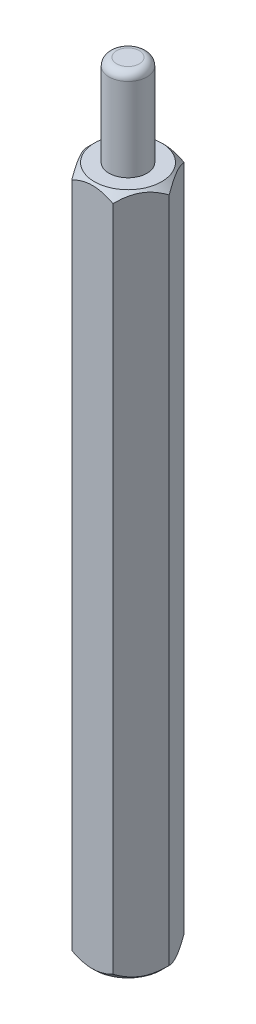
ISO-10303-21;
HEADER;
FILE_DESCRIPTION(('STEP AP214'),'2;1');
FILE_NAME('part.step','',(''),(''),'','','');
FILE_SCHEMA(('AUTOMOTIVE_DESIGN { 1 0 10303 214 1 1 1 1 }'));
ENDSEC;
DATA;
#1=APPLICATION_CONTEXT('core data for automotive mechanical design processes');
#2=APPLICATION_PROTOCOL_DEFINITION('international standard','automotive_design',2000,#1);
#3=PRODUCT_CONTEXT('',#1,'mechanical');
#4=PRODUCT('Part','Part','',(#3));
#5=PRODUCT_RELATED_PRODUCT_CATEGORY('part','',(#4));
#6=PRODUCT_DEFINITION_FORMATION('','',#4);
#7=PRODUCT_DEFINITION_CONTEXT('part definition',#1,'design');
#8=PRODUCT_DEFINITION('design','',#6,#7);
#9=PRODUCT_DEFINITION_SHAPE('','',#8);
#10=(LENGTH_UNIT() NAMED_UNIT(*) SI_UNIT(.MILLI.,.METRE.));
#11=(NAMED_UNIT(*) PLANE_ANGLE_UNIT() SI_UNIT($,.RADIAN.));
#12=(NAMED_UNIT(*) SI_UNIT($,.STERADIAN.) SOLID_ANGLE_UNIT());
#13=UNCERTAINTY_MEASURE_WITH_UNIT(LENGTH_MEASURE(1.E-05),#10,'distance_accuracy_value','');
#14=(GEOMETRIC_REPRESENTATION_CONTEXT(3) GLOBAL_UNCERTAINTY_ASSIGNED_CONTEXT((#13)) GLOBAL_UNIT_ASSIGNED_CONTEXT((#10,
#11,#12)) REPRESENTATION_CONTEXT('',''));
#15=CARTESIAN_POINT('',(0.,0.,0.));
#16=DIRECTION('',(0.,0.,1.));
#17=DIRECTION('',(1.,0.,0.));
#18=AXIS2_PLACEMENT_3D('',#15,#16,#17);
#19=CARTESIAN_POINT('',(0.,51.,0.));
#20=DIRECTION('',(0.,-1.,0.));
#21=DIRECTION('',(0.,0.,-1.));
#22=AXIS2_PLACEMENT_3D('',#19,#20,#21);
#23=CYLINDRICAL_SURFACE('',#22,1.25);
#24=CARTESIAN_POINT('',(0.,50.5,0.));
#25=DIRECTION('',(0.,1.,0.));
#26=DIRECTION('',(0.,0.,1.));
#27=AXIS2_PLACEMENT_3D('',#24,#25,#26);
#28=CIRCLE('',#27,1.25);
#29=CARTESIAN_POINT('',(0.,50.5,1.25));
#30=VERTEX_POINT('',#29);
#31=EDGE_CURVE('E11',#30,#30,#28,.F.);
#32=ORIENTED_EDGE('',*,*,#31,.T.);
#33=EDGE_LOOP('',(#32));
#34=FACE_BOUND('',#33,.T.);
#35=CARTESIAN_POINT('',(0.,45.,0.));
#36=DIRECTION('',(0.,1.,0.));
#37=DIRECTION('',(0.,0.,1.));
#38=AXIS2_PLACEMENT_3D('',#35,#36,#37);
#39=CIRCLE('',#38,1.25);
#40=CARTESIAN_POINT('',(0.,45.,1.25));
#41=VERTEX_POINT('',#40);
#42=EDGE_CURVE('E58',#41,#41,#39,.T.);
#43=ORIENTED_EDGE('',*,*,#42,.T.);
#44=EDGE_LOOP('',(#43));
#45=FACE_BOUND('',#44,.T.);
#46=ADVANCED_FACE('F47',(#34,#45),#23,.T.);
#47=CARTESIAN_POINT('',(0.,51.,0.));
#48=DIRECTION('',(0.,1.,0.));
#49=DIRECTION('',(0.,0.,1.));
#50=AXIS2_PLACEMENT_3D('',#47,#48,#49);
#51=PLANE('',#50);
#52=CARTESIAN_POINT('',(0.,51.,0.));
#53=DIRECTION('',(0.,1.,0.));
#54=DIRECTION('',(0.,0.,1.));
#55=AXIS2_PLACEMENT_3D('',#52,#53,#54);
#56=CIRCLE('',#55,0.75);
#57=CARTESIAN_POINT('',(0.,51.,0.75));
#58=VERTEX_POINT('',#57);
#59=EDGE_CURVE('E54',#58,#58,#56,.T.);
#60=ORIENTED_EDGE('',*,*,#59,.T.);
#61=EDGE_LOOP('',(#60));
#62=FACE_BOUND('',#61,.T.);
#63=ADVANCED_FACE('F68',(#62),#51,.T.);
#64=CARTESIAN_POINT('',(0.,45.,0.));
#65=DIRECTION('',(0.,1.,0.));
#66=DIRECTION('',(0.,0.,1.));
#67=AXIS2_PLACEMENT_3D('',#64,#65,#66);
#68=PLANE('',#67);
#69=ORIENTED_EDGE('',*,*,#42,.F.);
#70=EDGE_LOOP('',(#69));
#71=FACE_BOUND('',#70,.T.);
#72=ADVANCED_FACE('F66',(#71),#68,.F.);
#73=CARTESIAN_POINT('',(0.,50.5,0.));
#74=DIRECTION('',(0.,1.,0.));
#75=DIRECTION('',(0.,0.,1.));
#76=AXIS2_PLACEMENT_3D('',#73,#74,#75);
#77=TOROIDAL_SURFACE('',#76,0.75,0.5);
#78=ORIENTED_EDGE('',*,*,#31,.F.);
#79=EDGE_LOOP('',(#78));
#80=FACE_BOUND('',#79,.T.);
#81=ORIENTED_EDGE('',*,*,#59,.F.);
#82=EDGE_LOOP('',(#81));
#83=FACE_BOUND('',#82,.T.);
#84=ADVANCED_FACE('F49',(#80,#83),#77,.T.);
#85=CLOSED_SHELL('',(#46,#63,#72,#84));
#86=MANIFOLD_SOLID_BREP('B2',#85);
#87=CARTESIAN_POINT('',(1.35677313259565,45.,2.34999999999999));
#88=DIRECTION('',(-0.866025403784441,0.,-0.499999999999995));
#89=DIRECTION('',(-0.499999999999995,0.,0.866025403784441));
#90=AXIS2_PLACEMENT_3D('',#87,#88,#89);
#91=PLANE('',#90);
#92=CARTESIAN_POINT('',(2.71366173524508,0.500115477423954,-0.0002));
#93=CARTESIAN_POINT('',(2.66702181897453,0.45351442075486,0.0805827046413603));
#94=CARTESIAN_POINT('',(2.619602011949,0.409650231593763,0.162716219694685));
#95=CARTESIAN_POINT('',(2.5229077509184,0.329335803551845,0.33019559260002));
#96=CARTESIAN_POINT('',(2.47362410019065,0.292930253802988,0.415557379642964));
#97=CARTESIAN_POINT('',(2.37424596072594,0.230566757708878,0.5876853663575));
#98=CARTESIAN_POINT('',(2.3241767832868,0.204452056148391,0.674407725575282));
#99=CARTESIAN_POINT('',(2.22293612155872,0.164216868168014,0.84976169548021));
#100=CARTESIAN_POINT('',(2.17176773038475,0.150066345438941,0.938387948735085));
#101=CARTESIAN_POINT('',(2.08358239463315,0.137298959127493,1.09112943073937));
#102=CARTESIAN_POINT('',(2.04667938843036,0.13540889555121,1.15504731243464));
#103=CARTESIAN_POINT('',(1.97293369217404,0.138592545290332,1.28277860519013));
#104=CARTESIAN_POINT('',(1.93609102779937,0.143668700006084,1.34659197177326));
#105=CARTESIAN_POINT('',(1.86275357290835,0.160495922051712,1.47361616974231));
#106=CARTESIAN_POINT('',(1.82625921808281,0.172254456697005,1.53682624648959));
#107=CARTESIAN_POINT('',(1.75390158173959,0.201800980357546,1.66215334895163));
#108=CARTESIAN_POINT('',(1.71803825206632,0.219588507163032,1.72427045807434));
#109=CARTESIAN_POINT('',(1.62617552865636,0.272395503913702,1.88338136234204));
#110=CARTESIAN_POINT('',(1.57074576121927,0.311395733846912,1.97938853579481));
#111=CARTESIAN_POINT('',(1.48924118578274,0.377233579565033,2.12055860150021));
#112=CARTESIAN_POINT('',(1.46238179358799,0.400365987274775,2.16708043344193));
#113=CARTESIAN_POINT('',(1.40916054946841,0.44873951612495,2.25926233229908));
#114=CARTESIAN_POINT('',(1.38279840408548,0.47397934255917,2.30492290749882));
#115=CARTESIAN_POINT('',(1.35665766254181,0.500115477423954,2.35019999999999));
#116=B_SPLINE_CURVE_WITH_KNOTS('',3,(#92,#93,#94,#95,#96,#97,#98,#99,#100,#101,#102,#103,#104,
#105,#106,#107,#108,#109,#110,#111,#112,#113,#114,#115),.UNSPECIFIED.,.F.,.F.,(4,2,2,2,2,2,2,2,
2,2,2,4),(0.,0.313034643638936,0.627893288091257,0.937751034486846,1.24682854729337,
1.46800568908581,1.68926036503641,1.91076277253884,2.13224820250606,2.4840684999269,
2.65950165672958,2.83482781708433),.UNSPECIFIED.);
#117=CARTESIAN_POINT('',(2.71354626519124,0.5,0.));
#118=VERTEX_POINT('',#117);
#119=CARTESIAN_POINT('',(1.35677313259565,0.5,2.34999999999999));
#120=VERTEX_POINT('',#119);
#121=EDGE_CURVE('E118',#118,#120,#116,.T.);
#122=ORIENTED_EDGE('',*,*,#121,.F.);
#123=DIRECTION('',(0.,-1.,0.));
#124=VECTOR('',#123,1.);
#125=CARTESIAN_POINT('',(2.71354626519124,45.,0.));
#126=LINE('',#125,#124);
#127=CARTESIAN_POINT('',(2.71354626519124,44.5,0.));
#128=VERTEX_POINT('',#127);
#129=EDGE_CURVE('E45',#128,#118,#126,.T.);
#130=ORIENTED_EDGE('',*,*,#129,.F.);
#131=CARTESIAN_POINT('',(1.35665766254181,44.499884522576,2.35019999999999));
#132=CARTESIAN_POINT('',(1.40329757881236,44.5464855792451,2.26941729535863));
#133=CARTESIAN_POINT('',(1.45071738583789,44.5903497684062,2.1872837803053));
#134=CARTESIAN_POINT('',(1.54741164686849,44.6706641964482,2.01980440739997));
#135=CARTESIAN_POINT('',(1.59669529759624,44.707069746197,1.93444262035703));
#136=CARTESIAN_POINT('',(1.69607343706095,44.7694332422911,1.76231463364249));
#137=CARTESIAN_POINT('',(1.74614261450009,44.7955479438516,1.67559227442471));
#138=CARTESIAN_POINT('',(1.84738327622817,44.835783131832,1.50023830451978));
#139=CARTESIAN_POINT('',(1.89855166740214,44.8499336545611,1.4116120512649));
#140=CARTESIAN_POINT('',(1.98673700315374,44.8627010408725,1.25887056926062));
#141=CARTESIAN_POINT('',(2.02364000935653,44.8645911044488,1.19495268756535));
#142=CARTESIAN_POINT('',(2.09738570561285,44.8614074547097,1.06722139480986));
#143=CARTESIAN_POINT('',(2.13422836998752,44.8563312999939,1.00340802822673));
#144=CARTESIAN_POINT('',(2.20756582487854,44.8395040779483,0.876383830257679));
#145=CARTESIAN_POINT('',(2.24406017970408,44.827745543303,0.813173753510404));
#146=CARTESIAN_POINT('',(2.3164178160473,44.7981990196425,0.687846651048357));
#147=CARTESIAN_POINT('',(2.35228114572057,44.780411492837,0.625729541925651));
#148=CARTESIAN_POINT('',(2.44414386913053,44.7276044960863,0.466618637657948));
#149=CARTESIAN_POINT('',(2.49957363656762,44.6886042661531,0.370611464205183));
#150=CARTESIAN_POINT('',(2.58107821200415,44.622766420435,0.229441398499781));
#151=CARTESIAN_POINT('',(2.6079376041989,44.5996340127252,0.182919566558059));
#152=CARTESIAN_POINT('',(2.66115884831848,44.5512604838751,0.0907376677009108));
#153=CARTESIAN_POINT('',(2.68752099370141,44.5260206574408,0.0450770925011699));
#154=CARTESIAN_POINT('',(2.71366173524508,44.499884522576,-0.000200000000000689));
#155=B_SPLINE_CURVE_WITH_KNOTS('',3,(#131,#132,#133,#134,#135,#136,#137,#138,#139,#140,#141,
#142,#143,#144,#145,#146,#147,#148,#149,#150,#151,#152,#153,#154),.UNSPECIFIED.,.F.,.F.,(4,2,2,
2,2,2,2,2,2,2,2,4),(0.,0.313034643638934,0.627893288091256,0.937751034486844,1.24682854729337,
1.46800568908581,1.68926036503641,1.91076277253884,2.13224820250605,2.4840684999269,
2.65950165672958,2.83482781708433),.UNSPECIFIED.);
#156=CARTESIAN_POINT('',(1.35677313259565,44.5,2.34999999999999));
#157=VERTEX_POINT('',#156);
#158=EDGE_CURVE('E190',#157,#128,#155,.T.);
#159=ORIENTED_EDGE('',*,*,#158,.F.);
#160=DIRECTION('',(0.,-1.,0.));
#161=VECTOR('',#160,1.);
#162=CARTESIAN_POINT('',(1.35677313259565,45.,2.34999999999999));
#163=LINE('',#162,#161);
#164=EDGE_CURVE('E183',#157,#120,#163,.T.);
#165=ORIENTED_EDGE('',*,*,#164,.T.);
#166=EDGE_LOOP('',(#122,#130,#159,#165));
#167=FACE_BOUND('',#166,.T.);
#168=ADVANCED_FACE('F103',(#167),#91,.F.);
#169=CARTESIAN_POINT('',(2.71354626519124,45.,0.));
#170=DIRECTION('',(-0.866025403784438,0.,0.500000000000001));
#171=DIRECTION('',(0.500000000000001,0.,0.866025403784438));
#172=AXIS2_PLACEMENT_3D('',#169,#170,#171);
#173=PLANE('',#172);
#174=CARTESIAN_POINT('',(1.35665766254178,0.500115477423953,-2.3502));
#175=CARTESIAN_POINT('',(1.40329757881233,0.453514420754859,-2.26941729535864));
#176=CARTESIAN_POINT('',(1.45071738583786,0.40965023159376,-2.18728378030532));
#177=CARTESIAN_POINT('',(1.54741164686847,0.329335803551841,-2.01980440739998));
#178=CARTESIAN_POINT('',(1.59669529759622,0.292930253802983,-1.93444262035704));
#179=CARTESIAN_POINT('',(1.69607343706093,0.230566757708872,-1.7623146336425));
#180=CARTESIAN_POINT('',(1.74614261450007,0.204452056148384,-1.67559227442472));
#181=CARTESIAN_POINT('',(1.84738327622815,0.164216868168006,-1.50023830451979));
#182=CARTESIAN_POINT('',(1.89855166740212,0.150066345438932,-1.41161205126491));
#183=CARTESIAN_POINT('',(1.98673700315372,0.137298959127484,-1.25887056926063));
#184=CARTESIAN_POINT('',(2.02364000935651,0.135408895551201,-1.19495268756536));
#185=CARTESIAN_POINT('',(2.09738570561283,0.138592545290322,-1.06722139480987));
#186=CARTESIAN_POINT('',(2.1342283699875,0.143668700006074,-1.00340802822674));
#187=CARTESIAN_POINT('',(2.20756582487853,0.160495922051701,-0.876383830257692));
#188=CARTESIAN_POINT('',(2.24406017970406,0.172254456696994,-0.813173753510417));
#189=CARTESIAN_POINT('',(2.31641781604728,0.201800980357535,-0.687846651048371));
#190=CARTESIAN_POINT('',(2.35228114572056,0.219588507163021,-0.625729541925665));
#191=CARTESIAN_POINT('',(2.44414386913052,0.272395503913692,-0.466618637657959));
#192=CARTESIAN_POINT('',(2.49957363656761,0.311395733846904,-0.370611464205192));
#193=CARTESIAN_POINT('',(2.58107821200415,0.377233579565027,-0.229441398499786));
#194=CARTESIAN_POINT('',(2.6079376041989,0.400365987274771,-0.182919566558063));
#195=CARTESIAN_POINT('',(2.66115884831848,0.448739516124948,-0.0907376677009133));
#196=CARTESIAN_POINT('',(2.68752099370141,0.473979342559168,-0.045077092501172));
#197=CARTESIAN_POINT('',(2.71366173524508,0.500115477423954,0.000199999999999988));
#198=B_SPLINE_CURVE_WITH_KNOTS('',3,(#174,#175,#176,#177,#178,#179,#180,#181,#182,#183,#184,
#185,#186,#187,#188,#189,#190,#191,#192,#193,#194,#195,#196,#197),.UNSPECIFIED.,.F.,.F.,(4,2,2,
2,2,2,2,2,2,2,2,4),(0.,0.313034643638939,0.627893288091265,0.937751034486857,1.24682854729338,
1.46800568908582,1.68926036503642,1.91076277253885,2.13224820250607,2.48406849992692,
2.65950165672961,2.83482781708436),.UNSPECIFIED.);
#199=CARTESIAN_POINT('',(1.35677313259562,0.5,-2.35));
#200=VERTEX_POINT('',#199);
#201=EDGE_CURVE('E157',#200,#118,#198,.T.);
#202=ORIENTED_EDGE('',*,*,#201,.F.);
#203=DIRECTION('',(0.,-1.,0.));
#204=VECTOR('',#203,1.);
#205=CARTESIAN_POINT('',(1.35677313259562,45.,-2.35));
#206=LINE('',#205,#204);
#207=CARTESIAN_POINT('',(1.35677313259562,44.5,-2.35));
#208=VERTEX_POINT('',#207);
#209=EDGE_CURVE('E111',#208,#200,#206,.T.);
#210=ORIENTED_EDGE('',*,*,#209,.F.);
#211=CARTESIAN_POINT('',(2.71366173524508,44.499884522576,0.000200000000001139));
#212=CARTESIAN_POINT('',(2.66702181897453,44.5464855792451,-0.0805827046413599));
#213=CARTESIAN_POINT('',(2.619602011949,44.5903497684062,-0.162716219694686));
#214=CARTESIAN_POINT('',(2.52290775091839,44.6706641964482,-0.330195592600023));
#215=CARTESIAN_POINT('',(2.47362410019064,44.707069746197,-0.415557379642968));
#216=CARTESIAN_POINT('',(2.37424596072593,44.7694332422911,-0.587685366357505));
#217=CARTESIAN_POINT('',(2.32417678328679,44.7955479438516,-0.674407725575288));
#218=CARTESIAN_POINT('',(2.2229361215587,44.835783131832,-0.849761695480218));
#219=CARTESIAN_POINT('',(2.17176773038473,44.8499336545611,-0.938387948735094));
#220=CARTESIAN_POINT('',(2.08358239463314,44.8627010408725,-1.09112943073938));
#221=CARTESIAN_POINT('',(2.04667938843034,44.8645911044488,-1.15504731243465));
#222=CARTESIAN_POINT('',(1.97293369217402,44.8614074547097,-1.28277860519014));
#223=CARTESIAN_POINT('',(1.93609102779936,44.8563312999939,-1.34659197177327));
#224=CARTESIAN_POINT('',(1.86275357290833,44.8395040779483,-1.47361616974232));
#225=CARTESIAN_POINT('',(1.82625921808279,44.827745543303,-1.53682624648959));
#226=CARTESIAN_POINT('',(1.75390158173957,44.7981990196425,-1.66215334895164));
#227=CARTESIAN_POINT('',(1.7180382520663,44.780411492837,-1.72427045807434));
#228=CARTESIAN_POINT('',(1.62617552865633,44.7276044960863,-1.88338136234205));
#229=CARTESIAN_POINT('',(1.57074576121924,44.6886042661531,-1.97938853579482));
#230=CARTESIAN_POINT('',(1.48924118578271,44.622766420435,-2.12055860150022));
#231=CARTESIAN_POINT('',(1.46238179358796,44.5996340127252,-2.16708043344194));
#232=CARTESIAN_POINT('',(1.40916054946838,44.551260483875,-2.25926233229909));
#233=CARTESIAN_POINT('',(1.38279840408545,44.5260206574408,-2.30492290749883));
#234=CARTESIAN_POINT('',(1.35665766254178,44.499884522576,-2.3502));
#235=B_SPLINE_CURVE_WITH_KNOTS('',3,(#211,#212,#213,#214,#215,#216,#217,#218,#219,#220,#221,
#222,#223,#224,#225,#226,#227,#228,#229,#230,#231,#232,#233,#234),.UNSPECIFIED.,.F.,.F.,(4,2,2,
2,2,2,2,2,2,2,2,4),(0.,0.313034643638944,0.627893288091269,0.937751034486862,1.24682854729339,
1.46800568908583,1.68926036503643,1.91076277253886,2.13224820250608,2.48406849992693,
2.65950165672962,2.83482781708437),.UNSPECIFIED.);
#236=EDGE_CURVE('E199',#128,#208,#235,.T.);
#237=ORIENTED_EDGE('',*,*,#236,.F.);
#238=ORIENTED_EDGE('',*,*,#129,.T.);
#239=EDGE_LOOP('',(#202,#210,#237,#238));
#240=FACE_BOUND('',#239,.T.);
#241=ADVANCED_FACE('F167',(#240),#173,.F.);
#242=CARTESIAN_POINT('',(1.35677313259562,45.,-2.35));
#243=DIRECTION('',(0.,0.,1.));
#244=DIRECTION('',(1.,0.,0.));
#245=AXIS2_PLACEMENT_3D('',#242,#243,#244);
#246=PLANE('',#245);
#247=CARTESIAN_POINT('',(-4.11620007747229,2.5262430843245,-2.34999999999999));
#248=CARTESIAN_POINT('',(-3.99456062407984,2.4206482959392,-2.34999999999999));
#249=CARTESIAN_POINT('',(-3.87238420139626,2.31565939195619,-2.34999999999999));
#250=CARTESIAN_POINT('',(-3.62654046205172,2.10732553559251,-2.34999999999999));
#251=CARTESIAN_POINT('',(-3.50287246949324,2.00398138180499,-2.34999999999999));
#252=CARTESIAN_POINT('',(-3.25092428246666,1.79715607348113,-2.34999999999999));
#253=CARTESIAN_POINT('',(-3.1226030423497,1.69372472451252,-2.34999999999999));
#254=CARTESIAN_POINT('',(-2.86355572230193,1.48997092714896,-2.34999999999999));
#255=CARTESIAN_POINT('',(-2.73283025157604,1.38964770802441,-2.34999999999999));
#256=CARTESIAN_POINT('',(-2.46800641513511,1.1931600446047,-2.34999999999999));
#257=CARTESIAN_POINT('',(-2.3339038896,1.09700117040959,-2.34999999999999));
#258=CARTESIAN_POINT('',(-2.0613032743926,0.910799147560652,-2.34999999999999));
#259=CARTESIAN_POINT('',(-1.92280172588298,0.820760995346968,-2.34999999999999));
#260=CARTESIAN_POINT('',(-1.64117355798615,0.650614047542825,-2.34999999999999));
#261=CARTESIAN_POINT('',(-1.49808943768717,0.570435820386812,-2.34999999999999));
#262=CARTESIAN_POINT('',(-1.20485643379896,0.424271739306381,-2.35));
#263=CARTESIAN_POINT('',(-1.05472107043102,0.358259975814249,-2.35));
#264=CARTESIAN_POINT('',(-0.821865462112486,0.274942485534353,-2.35));
#265=CARTESIAN_POINT('',(-0.742036508278312,0.249595685883113,-2.35));
#266=CARTESIAN_POINT('',(-0.580476501018406,0.205835788601103,-2.35));
#267=CARTESIAN_POINT('',(-0.498745753007967,0.187421585691351,-2.35));
#268=CARTESIAN_POINT('',(-0.334372246307214,0.15875365473776,-2.35));
#269=CARTESIAN_POINT('',(-0.251738546335381,0.148448964635506,-2.35));
#270=CARTESIAN_POINT('',(-0.0858407417653295,0.136566289649942,-2.35));
#271=CARTESIAN_POINT('',(-0.0025767092684989,0.134987321327513,-2.35));
#272=CARTESIAN_POINT('',(0.163777303536675,0.140683761884499,-2.35));
#273=CARTESIAN_POINT('',(0.246866776487838,0.147973655828653,-2.35));
#274=CARTESIAN_POINT('',(0.41188263216069,0.170874266382379,-2.35));
#275=CARTESIAN_POINT('',(0.493808778405905,0.186486650583509,-2.35));
#276=CARTESIAN_POINT('',(0.656483138387225,0.225136666290385,-2.35));
#277=CARTESIAN_POINT('',(0.737218600446381,0.24822702200939,-2.35));
#278=CARTESIAN_POINT('',(0.89663513591736,0.300570119750988,-2.35));
#279=CARTESIAN_POINT('',(0.975316175413214,0.329822963436416,-2.35));
#280=CARTESIAN_POINT('',(1.14744588710944,0.40020384861402,-2.35));
#281=CARTESIAN_POINT('',(1.24039977634963,0.442531557975459,-2.35));
#282=CARTESIAN_POINT('',(1.42354442733167,0.5328381943151,-2.35));
#283=CARTESIAN_POINT('',(1.51373356413394,0.580820367305654,-2.35));
#284=CARTESIAN_POINT('',(1.69185571070467,0.681182160709708,-2.35000000000001));
#285=CARTESIAN_POINT('',(1.77978369059033,0.733570635503711,-2.35000000000001));
#286=CARTESIAN_POINT('',(1.95354761418705,0.841649940673026,-2.35000000000001));
#287=CARTESIAN_POINT('',(2.03938396636662,0.897340118855265,-2.35000000000001));
#288=CARTESIAN_POINT('',(2.20977468778742,1.01160311087831,-2.35000000000001));
#289=CARTESIAN_POINT('',(2.29431973959118,1.07018975488298,-2.35000000000001));
#290=CARTESIAN_POINT('',(2.46194608751648,1.18942577021325,-2.35000000000001));
#291=CARTESIAN_POINT('',(2.54502727250729,1.25007529712891,-2.35000000000001));
#292=CARTESIAN_POINT('',(2.79224195212483,1.43432754969047,-2.35000000000001));
#293=CARTESIAN_POINT('',(2.95455149425201,1.56037440725252,-2.35000000000001));
#294=CARTESIAN_POINT('',(3.28611603645723,1.82508053476038,-2.35000000000001));
#295=CARTESIAN_POINT('',(3.45513899155155,1.96402766342604,-2.35000000000001));
#296=CARTESIAN_POINT('',(3.70562895012552,2.17418356155825,-2.35000000000001));
#297=CARTESIAN_POINT('',(3.78816309544242,2.24412720654322,-2.35000000000001));
#298=CARTESIAN_POINT('',(3.95261548683786,2.38469838643999,-2.35000000000001));
#299=CARTESIAN_POINT('',(4.0345338656113,2.45532576604052,-2.35000000000001));
#300=CARTESIAN_POINT('',(4.11620007747227,2.5262430843245,-2.35000000000001));
#301=B_SPLINE_CURVE_WITH_KNOTS('',3,(#247,#248,#249,#250,#251,#252,#253,#254,#255,#256,#257,
#258,#259,#260,#261,#262,#263,#264,#265,#266,#267,#268,#269,#270,#271,#272,#273,#274,#275,#276,
#277,#278,#279,#280,#281,#282,#283,#284,#285,#286,#287,#288,#289,#290,#291,#292,#293,#294,#295,
#296,#297,#298,#299,#300),.UNSPECIFIED.,.F.,.F.,(4,2,2,2,2,2,2,2,2,2,2,2,2,2,2,2,2,2,2,2,2,2,2,
2,2,2,4),(0.,0.483247159798947,0.96672220657701,1.46113633492303,1.95542686476531,
2.45035931762353,2.94569105676271,3.43730630445939,3.92801460806787,4.17903396485375,
4.43001328411246,4.67940250839623,4.92876362450418,5.17853255685014,5.42835155464483,
5.67997173963929,5.93159607594807,6.23774941921089,6.5440793775366,6.85104032130647,
7.15794083110096,7.46648353445715,7.77504956104604,8.39143691317243,9.04779093244822,
9.37234292136602,9.6968228413157),.UNSPECIFIED.);
#302=CARTESIAN_POINT('',(-1.35677313259563,0.5,-2.35));
#303=VERTEX_POINT('',#302);
#304=EDGE_CURVE('E154',#303,#200,#301,.T.);
#305=ORIENTED_EDGE('',*,*,#304,.F.);
#306=DIRECTION('',(0.,-1.,0.));
#307=VECTOR('',#306,1.);
#308=CARTESIAN_POINT('',(-1.35677313259563,45.,-2.35));
#309=LINE('',#308,#307);
#310=CARTESIAN_POINT('',(-1.35677313259563,44.5,-2.35));
#311=VERTEX_POINT('',#310);
#312=EDGE_CURVE('E174',#311,#303,#309,.T.);
#313=ORIENTED_EDGE('',*,*,#312,.F.);
#314=CARTESIAN_POINT('',(4.11620007747227,42.4737569156755,-2.35000000000001));
#315=CARTESIAN_POINT('',(3.99456062407982,42.5793517040608,-2.35000000000001));
#316=CARTESIAN_POINT('',(3.87238420139625,42.6843406080438,-2.35000000000001));
#317=CARTESIAN_POINT('',(3.62654046205171,42.8926744644075,-2.35000000000001));
#318=CARTESIAN_POINT('',(3.50287246949323,42.996018618195,-2.35000000000001));
#319=CARTESIAN_POINT('',(3.25092428246665,43.2028439265189,-2.35000000000001));
#320=CARTESIAN_POINT('',(3.12260304234969,43.3062752754875,-2.35000000000001));
#321=CARTESIAN_POINT('',(2.86355572230191,43.510029072851,-2.35000000000001));
#322=CARTESIAN_POINT('',(2.73283025157602,43.6103522919756,-2.35000000000001));
#323=CARTESIAN_POINT('',(2.4680064151351,43.8068399553953,-2.35000000000001));
#324=CARTESIAN_POINT('',(2.33390388959998,43.9029988295904,-2.35000000000001));
#325=CARTESIAN_POINT('',(2.06130327439258,44.0892008524393,-2.35000000000001));
#326=CARTESIAN_POINT('',(1.92280172588297,44.179239004653,-2.35000000000001));
#327=CARTESIAN_POINT('',(1.64117355798613,44.3493859524572,-2.35000000000001));
#328=CARTESIAN_POINT('',(1.49808943768715,44.4295641796132,-2.35));
#329=CARTESIAN_POINT('',(1.20485643379894,44.5757282606936,-2.35));
#330=CARTESIAN_POINT('',(1.054721070431,44.6417400241858,-2.35));
#331=CARTESIAN_POINT('',(0.821865462112468,44.7250575144656,-2.35));
#332=CARTESIAN_POINT('',(0.742036508278293,44.7504043141169,-2.35));
#333=CARTESIAN_POINT('',(0.580476501018388,44.7941642113989,-2.35));
#334=CARTESIAN_POINT('',(0.498745753007949,44.8125784143086,-2.35));
#335=CARTESIAN_POINT('',(0.334372246307196,44.8412463452622,-2.35));
#336=CARTESIAN_POINT('',(0.251738546335362,44.8515510353645,-2.35));
#337=CARTESIAN_POINT('',(0.0858407417653112,44.8634337103501,-2.35));
#338=CARTESIAN_POINT('',(0.00257670926848094,44.8650126786725,-2.35));
#339=CARTESIAN_POINT('',(-0.163777303536692,44.8593162381155,-2.35));
#340=CARTESIAN_POINT('',(-0.246866776487855,44.8520263441713,-2.35));
#341=CARTESIAN_POINT('',(-0.411882632160707,44.8291257336176,-2.35));
#342=CARTESIAN_POINT('',(-0.493808778405922,44.8135133494165,-2.35));
#343=CARTESIAN_POINT('',(-0.656483138387242,44.7748633337096,-2.35));
#344=CARTESIAN_POINT('',(-0.737218600446397,44.7517729779906,-2.35));
#345=CARTESIAN_POINT('',(-0.896635135917376,44.699429880249,-2.35));
#346=CARTESIAN_POINT('',(-0.97531617541323,44.6701770365636,-2.35));
#347=CARTESIAN_POINT('',(-1.14744588710946,44.599796151386,-2.35));
#348=CARTESIAN_POINT('',(-1.24039977634965,44.5574684420245,-2.35));
#349=CARTESIAN_POINT('',(-1.42354442733168,44.4671618056849,-2.34999999999999));
#350=CARTESIAN_POINT('',(-1.51373356413396,44.4191796326943,-2.34999999999999));
#351=CARTESIAN_POINT('',(-1.69185571070468,44.3188178392903,-2.34999999999999));
#352=CARTESIAN_POINT('',(-1.77978369059035,44.2664293644963,-2.34999999999999));
#353=CARTESIAN_POINT('',(-1.95354761418706,44.158350059327,-2.34999999999999));
#354=CARTESIAN_POINT('',(-2.03938396636663,44.1026598811447,-2.34999999999999));
#355=CARTESIAN_POINT('',(-2.20977468778744,43.9883968891217,-2.34999999999999));
#356=CARTESIAN_POINT('',(-2.2943197395912,43.929810245117,-2.34999999999999));
#357=CARTESIAN_POINT('',(-2.46194608751649,43.8105742297867,-2.34999999999999));
#358=CARTESIAN_POINT('',(-2.54502727250731,43.7499247028711,-2.34999999999999));
#359=CARTESIAN_POINT('',(-2.79224195212485,43.5656724503095,-2.34999999999999));
#360=CARTESIAN_POINT('',(-2.95455149425203,43.4396255927475,-2.34999999999999));
#361=CARTESIAN_POINT('',(-3.28611603645725,43.1749194652396,-2.34999999999999));
#362=CARTESIAN_POINT('',(-3.45513899155157,43.035972336574,-2.34999999999999));
#363=CARTESIAN_POINT('',(-3.70562895012554,42.8258164384417,-2.34999999999999));
#364=CARTESIAN_POINT('',(-3.78816309544244,42.7558727934568,-2.34999999999999));
#365=CARTESIAN_POINT('',(-3.95261548683787,42.61530161356,-2.34999999999999));
#366=CARTESIAN_POINT('',(-4.03453386561132,42.5446742339595,-2.34999999999999));
#367=CARTESIAN_POINT('',(-4.11620007747229,42.4737569156755,-2.34999999999999));
#368=B_SPLINE_CURVE_WITH_KNOTS('',3,(#314,#315,#316,#317,#318,#319,#320,#321,#322,#323,#324,
#325,#326,#327,#328,#329,#330,#331,#332,#333,#334,#335,#336,#337,#338,#339,#340,#341,#342,#343,
#344,#345,#346,#347,#348,#349,#350,#351,#352,#353,#354,#355,#356,#357,#358,#359,#360,#361,#362,
#363,#364,#365,#366,#367),.UNSPECIFIED.,.F.,.F.,(4,2,2,2,2,2,2,2,2,2,2,2,2,2,2,2,2,2,2,2,2,2,2,
2,2,2,4),(0.,0.483247159798941,0.966722206577005,1.46113633492303,1.95542686476531,
2.45035931762353,2.94569105676272,3.43730630445939,3.92801460806787,4.17903396485375,
4.43001328411246,4.67940250839623,4.92876362450418,5.17853255685014,5.42835155464483,
5.67997173963929,5.93159607594806,6.23774941921089,6.5440793775366,6.85104032130647,
7.15794083110096,7.46648353445715,7.77504956104604,8.39143691317244,9.04779093244822,
9.37234292136603,9.6968228413157),.UNSPECIFIED.);
#369=EDGE_CURVE('E173',#208,#311,#368,.T.);
#370=ORIENTED_EDGE('',*,*,#369,.F.);
#371=ORIENTED_EDGE('',*,*,#209,.T.);
#372=EDGE_LOOP('',(#305,#313,#370,#371));
#373=FACE_BOUND('',#372,.T.);
#374=ADVANCED_FACE('F172',(#373),#246,.F.);
#375=CARTESIAN_POINT('',(-1.35677313259563,45.,-2.35));
#376=DIRECTION('',(0.866025403784441,0.,0.499999999999995));
#377=DIRECTION('',(0.499999999999995,0.,-0.866025403784442));
#378=AXIS2_PLACEMENT_3D('',#375,#376,#377);
#379=PLANE('',#378);
#380=CARTESIAN_POINT('',(-2.71366173524508,0.500115477423953,0.000200000000018949));
#381=CARTESIAN_POINT('',(-2.66702181897453,0.453514420754859,-0.080582704641342));
#382=CARTESIAN_POINT('',(-2.619602011949,0.409650231593761,-0.162716219694667));
#383=CARTESIAN_POINT('',(-2.52290775091839,0.329335803551842,-0.330195592600005));
#384=CARTESIAN_POINT('',(-2.47362410019064,0.292930253802984,-0.41555737964295));
#385=CARTESIAN_POINT('',(-2.37424596072594,0.230566757708871,-0.587685366357487));
#386=CARTESIAN_POINT('',(-2.32417678328679,0.204452056148383,-0.674407725575269));
#387=CARTESIAN_POINT('',(-2.22293612155871,0.164216868168005,-0.8497616954802));
#388=CARTESIAN_POINT('',(-2.17176773038474,0.150066345438932,-0.938387948735077));
#389=CARTESIAN_POINT('',(-2.08358239463315,0.137298959127484,-1.09112943073936));
#390=CARTESIAN_POINT('',(-2.04667938843035,0.1354088955512,-1.15504731243463));
#391=CARTESIAN_POINT('',(-1.97293369217403,0.138592545290322,-1.28277860519012));
#392=CARTESIAN_POINT('',(-1.93609102779937,0.143668700006074,-1.34659197177325));
#393=CARTESIAN_POINT('',(-1.86275357290834,0.160495922051702,-1.4736161697423));
#394=CARTESIAN_POINT('',(-1.82625921808281,0.172254456696994,-1.53682624648957));
#395=CARTESIAN_POINT('',(-1.75390158173959,0.201800980357534,-1.66215334895162));
#396=CARTESIAN_POINT('',(-1.71803825206631,0.219588507163021,-1.72427045807433));
#397=CARTESIAN_POINT('',(-1.62617552865635,0.272395503913691,-1.88338136234204));
#398=CARTESIAN_POINT('',(-1.57074576121926,0.311395733846904,-1.9793885357948));
#399=CARTESIAN_POINT('',(-1.48924118578273,0.377233579565027,-2.12055860150021));
#400=CARTESIAN_POINT('',(-1.46238179358798,0.400365987274771,-2.16708043344193));
#401=CARTESIAN_POINT('',(-1.40916054946839,0.448739516124948,-2.25926233229908));
#402=CARTESIAN_POINT('',(-1.38279840408547,0.473979342559168,-2.30492290749882));
#403=CARTESIAN_POINT('',(-1.35665766254179,0.500115477423954,-2.3502));
#404=B_SPLINE_CURVE_WITH_KNOTS('',3,(#380,#381,#382,#383,#384,#385,#386,#387,#388,#389,#390,
#391,#392,#393,#394,#395,#396,#397,#398,#399,#400,#401,#402,#403),.UNSPECIFIED.,.F.,.F.,(4,2,2,
2,2,2,2,2,2,2,2,4),(0.,0.313034643638939,0.627893288091265,0.937751034486857,1.24682854729339,
1.46800568908582,1.68926036503642,1.91076277253885,2.13224820250607,2.48406849992692,
2.65950165672961,2.83482781708436),.UNSPECIFIED.);
#405=CARTESIAN_POINT('',(-2.71354626519124,0.5,0.));
#406=VERTEX_POINT('',#405);
#407=EDGE_CURVE('E159',#406,#303,#404,.T.);
#408=ORIENTED_EDGE('',*,*,#407,.F.);
#409=DIRECTION('',(0.,-1.,0.));
#410=VECTOR('',#409,1.);
#411=CARTESIAN_POINT('',(-2.71354626519124,45.,0.));
#412=LINE('',#411,#410);
#413=CARTESIAN_POINT('',(-2.71354626519124,44.5,0.));
#414=VERTEX_POINT('',#413);
#415=EDGE_CURVE('E175',#414,#406,#412,.T.);
#416=ORIENTED_EDGE('',*,*,#415,.F.);
#417=CARTESIAN_POINT('',(-1.35665766254179,44.499884522576,-2.3502));
#418=CARTESIAN_POINT('',(-1.40329757881235,44.5464855792451,-2.26941729535864));
#419=CARTESIAN_POINT('',(-1.45071738583788,44.5903497684062,-2.18728378030531));
#420=CARTESIAN_POINT('',(-1.54741164686848,44.6706641964482,-2.01980440739997));
#421=CARTESIAN_POINT('',(-1.59669529759623,44.707069746197,-1.93444262035703));
#422=CARTESIAN_POINT('',(-1.69607343706094,44.7694332422911,-1.76231463364249));
#423=CARTESIAN_POINT('',(-1.74614261450009,44.7955479438516,-1.6755922744247));
#424=CARTESIAN_POINT('',(-1.84738327622817,44.835783131832,-1.50023830451977));
#425=CARTESIAN_POINT('',(-1.89855166740214,44.8499336545611,-1.4116120512649));
#426=CARTESIAN_POINT('',(-1.98673700315373,44.8627010408725,-1.25887056926061));
#427=CARTESIAN_POINT('',(-2.02364000935652,44.8645911044488,-1.19495268756534));
#428=CARTESIAN_POINT('',(-2.09738570561284,44.8614074547097,-1.06722139480985));
#429=CARTESIAN_POINT('',(-2.13422836998751,44.8563312999939,-1.00340802822672));
#430=CARTESIAN_POINT('',(-2.20756582487854,44.8395040779483,-0.876383830257669));
#431=CARTESIAN_POINT('',(-2.24406017970407,44.827745543303,-0.813173753510395));
#432=CARTESIAN_POINT('',(-2.31641781604729,44.7981990196425,-0.687846651048348));
#433=CARTESIAN_POINT('',(-2.35228114572057,44.780411492837,-0.625729541925642));
#434=CARTESIAN_POINT('',(-2.44414386913053,44.7276044960863,-0.466618637657936));
#435=CARTESIAN_POINT('',(-2.49957363656762,44.6886042661531,-0.370611464205169));
#436=CARTESIAN_POINT('',(-2.58107821200415,44.622766420435,-0.229441398499766));
#437=CARTESIAN_POINT('',(-2.6079376041989,44.5996340127252,-0.182919566558045));
#438=CARTESIAN_POINT('',(-2.66115884831848,44.551260483875,-0.0907376677008967));
#439=CARTESIAN_POINT('',(-2.6875209937014,44.5260206574408,-0.0450770925011546));
#440=CARTESIAN_POINT('',(-2.71366173524508,44.499884522576,0.000200000000018991));
#441=B_SPLINE_CURVE_WITH_KNOTS('',3,(#417,#418,#419,#420,#421,#422,#423,#424,#425,#426,#427,
#428,#429,#430,#431,#432,#433,#434,#435,#436,#437,#438,#439,#440),.UNSPECIFIED.,.F.,.F.,(4,2,2,
2,2,2,2,2,2,2,2,4),(0.,0.313034643638945,0.62789328809127,0.937751034486865,1.24682854729339,
1.46800568908583,1.68926036503643,1.91076277253887,2.13224820250608,2.48406849992693,
2.65950165672961,2.83482781708437),.UNSPECIFIED.);
#442=EDGE_CURVE('E236',#311,#414,#441,.T.);
#443=ORIENTED_EDGE('',*,*,#442,.F.);
#444=ORIENTED_EDGE('',*,*,#312,.T.);
#445=EDGE_LOOP('',(#408,#416,#443,#444));
#446=FACE_BOUND('',#445,.T.);
#447=ADVANCED_FACE('F249',(#446),#379,.F.);
#448=CARTESIAN_POINT('',(-2.71354626519124,45.,0.));
#449=DIRECTION('',(0.866025403784434,0.,-0.500000000000007));
#450=DIRECTION('',(-0.500000000000007,0.,-0.866025403784435));
#451=AXIS2_PLACEMENT_3D('',#448,#449,#450);
#452=PLANE('',#451);
#453=CARTESIAN_POINT('',(-1.35665766254176,0.500115477423953,2.35020000000001));
#454=CARTESIAN_POINT('',(-1.40329757881232,0.453514420754859,2.26941729535865));
#455=CARTESIAN_POINT('',(-1.45071738583785,0.40965023159376,2.18728378030533));
#456=CARTESIAN_POINT('',(-1.54741164686845,0.329335803551841,2.01980440739999));
#457=CARTESIAN_POINT('',(-1.59669529759621,0.292930253802983,1.93444262035705));
#458=CARTESIAN_POINT('',(-1.69607343706091,0.230566757708871,1.76231463364251));
#459=CARTESIAN_POINT('',(-1.74614261450006,0.204452056148384,1.67559227442473));
#460=CARTESIAN_POINT('',(-1.84738327622814,0.164216868168006,1.5002383045198));
#461=CARTESIAN_POINT('',(-1.89855166740211,0.150066345438931,1.41161205126493));
#462=CARTESIAN_POINT('',(-1.98673700315371,0.137298959127484,1.25887056926064));
#463=CARTESIAN_POINT('',(-2.0236400093565,0.1354088955512,1.19495268756538));
#464=CARTESIAN_POINT('',(-2.09738570561283,0.138592545290322,1.06722139480989));
#465=CARTESIAN_POINT('',(-2.13422836998749,0.143668700006073,1.00340802822676));
#466=CARTESIAN_POINT('',(-2.20756582487852,0.160495922051702,0.876383830257706));
#467=CARTESIAN_POINT('',(-2.24406017970406,0.172254456696994,0.813173753510432));
#468=CARTESIAN_POINT('',(-2.31641781604728,0.201800980357535,0.687846651048386));
#469=CARTESIAN_POINT('',(-2.35228114572055,0.219588507163021,0.62572954192568));
#470=CARTESIAN_POINT('',(-2.44414386913052,0.272395503913692,0.466618637657975));
#471=CARTESIAN_POINT('',(-2.49957363656761,0.311395733846904,0.370611464205209));
#472=CARTESIAN_POINT('',(-2.58107821200415,0.377233579565028,0.229441398499804));
#473=CARTESIAN_POINT('',(-2.60793760419889,0.400365987274771,0.182919566558081));
#474=CARTESIAN_POINT('',(-2.66115884831848,0.448739516124948,0.0907376677009316));
#475=CARTESIAN_POINT('',(-2.68752099370141,0.473979342559168,0.0450770925011907));
#476=CARTESIAN_POINT('',(-2.71366173524508,0.500115477423954,-0.000199999999981032));
#477=B_SPLINE_CURVE_WITH_KNOTS('',3,(#453,#454,#455,#456,#457,#458,#459,#460,#461,#462,#463,
#464,#465,#466,#467,#468,#469,#470,#471,#472,#473,#474,#475,#476),.UNSPECIFIED.,.F.,.F.,(4,2,2,
2,2,2,2,2,2,2,2,4),(0.,0.31303464363894,0.627893288091265,0.937751034486857,1.24682854729339,
1.46800568908582,1.68926036503642,1.91076277253886,2.13224820250607,2.48406849992692,
2.65950165672961,2.83482781708436),.UNSPECIFIED.);
#478=CARTESIAN_POINT('',(-1.3567731325956,0.5,2.35000000000001));
#479=VERTEX_POINT('',#478);
#480=EDGE_CURVE('E283',#479,#406,#477,.T.);
#481=ORIENTED_EDGE('',*,*,#480,.F.);
#482=DIRECTION('',(0.,-1.,0.));
#483=VECTOR('',#482,1.);
#484=CARTESIAN_POINT('',(-1.3567731325956,45.,2.35000000000001));
#485=LINE('',#484,#483);
#486=CARTESIAN_POINT('',(-1.3567731325956,44.5,2.35000000000001));
#487=VERTEX_POINT('',#486);
#488=EDGE_CURVE('E180',#487,#479,#485,.T.);
#489=ORIENTED_EDGE('',*,*,#488,.F.);
#490=CARTESIAN_POINT('',(-2.71366173524508,44.499884522576,-0.000199999999982189));
#491=CARTESIAN_POINT('',(-2.66702181897452,44.5464855792451,0.0805827046413784));
#492=CARTESIAN_POINT('',(-2.619602011949,44.5903497684062,0.162716219694704));
#493=CARTESIAN_POINT('',(-2.52290775091839,44.6706641964482,0.330195592600041));
#494=CARTESIAN_POINT('',(-2.47362410019064,44.707069746197,0.415557379642985));
#495=CARTESIAN_POINT('',(-2.37424596072593,44.7694332422911,0.587685366357522));
#496=CARTESIAN_POINT('',(-2.32417678328678,44.7955479438516,0.674407725575304));
#497=CARTESIAN_POINT('',(-2.2229361215587,44.835783131832,0.849761695480234));
#498=CARTESIAN_POINT('',(-2.17176773038473,44.8499336545611,0.938387948735109));
#499=CARTESIAN_POINT('',(-2.08358239463313,44.8627010408725,1.09112943073939));
#500=CARTESIAN_POINT('',(-2.04667938843034,44.8645911044488,1.15504731243466));
#501=CARTESIAN_POINT('',(-1.97293369217401,44.8614074547097,1.28277860519015));
#502=CARTESIAN_POINT('',(-1.93609102779935,44.8563312999939,1.34659197177328));
#503=CARTESIAN_POINT('',(-1.86275357290832,44.8395040779483,1.47361616974233));
#504=CARTESIAN_POINT('',(-1.82625921808278,44.827745543303,1.5368262464896));
#505=CARTESIAN_POINT('',(-1.75390158173956,44.7981990196425,1.66215334895165));
#506=CARTESIAN_POINT('',(-1.71803825206629,44.780411492837,1.72427045807436));
#507=CARTESIAN_POINT('',(-1.62617552865632,44.7276044960863,1.88338136234206));
#508=CARTESIAN_POINT('',(-1.57074576121923,44.6886042661531,1.97938853579483));
#509=CARTESIAN_POINT('',(-1.4892411857827,44.622766420435,2.12055860150023));
#510=CARTESIAN_POINT('',(-1.46238179358795,44.5996340127252,2.16708043344195));
#511=CARTESIAN_POINT('',(-1.40916054946836,44.551260483875,2.2592623322991));
#512=CARTESIAN_POINT('',(-1.38279840408544,44.5260206574408,2.30492290749884));
#513=CARTESIAN_POINT('',(-1.35665766254176,44.499884522576,2.35020000000001));
#514=B_SPLINE_CURVE_WITH_KNOTS('',3,(#490,#491,#492,#493,#494,#495,#496,#497,#498,#499,#500,
#501,#502,#503,#504,#505,#506,#507,#508,#509,#510,#511,#512,#513),.UNSPECIFIED.,.F.,.F.,(4,2,2,
2,2,2,2,2,2,2,2,4),(0.,0.313034643638944,0.627893288091269,0.937751034486862,1.24682854729339,
1.46800568908583,1.68926036503643,1.91076277253886,2.13224820250608,2.48406849992693,
2.65950165672962,2.83482781708437),.UNSPECIFIED.);
#515=EDGE_CURVE('E126',#414,#487,#514,.T.);
#516=ORIENTED_EDGE('',*,*,#515,.F.);
#517=ORIENTED_EDGE('',*,*,#415,.T.);
#518=EDGE_LOOP('',(#481,#489,#516,#517));
#519=FACE_BOUND('',#518,.T.);
#520=ADVANCED_FACE('F282',(#519),#452,.F.);
#521=CARTESIAN_POINT('',(-1.3567731325956,45.,2.35000000000001));
#522=DIRECTION('',(0.,0.,-1.));
#523=DIRECTION('',(-1.,0.,0.));
#524=AXIS2_PLACEMENT_3D('',#521,#522,#523);
#525=PLANE('',#524);
#526=CARTESIAN_POINT('',(4.11620007747231,2.5262430843245,2.34999999999996));
#527=CARTESIAN_POINT('',(3.99456062407985,2.4206482959392,2.34999999999996));
#528=CARTESIAN_POINT('',(3.87238420139628,2.31565939195619,2.34999999999996));
#529=CARTESIAN_POINT('',(3.62654046205174,2.10732553559251,2.34999999999996));
#530=CARTESIAN_POINT('',(3.50287246949326,2.00398138180499,2.34999999999996));
#531=CARTESIAN_POINT('',(3.25092428246668,1.79715607348114,2.34999999999997));
#532=CARTESIAN_POINT('',(3.12260304234972,1.69372472451252,2.34999999999997));
#533=CARTESIAN_POINT('',(2.86355572230194,1.48997092714896,2.34999999999997));
#534=CARTESIAN_POINT('',(2.73283025157605,1.38964770802441,2.34999999999997));
#535=CARTESIAN_POINT('',(2.46800641513513,1.19316004460471,2.34999999999997));
#536=CARTESIAN_POINT('',(2.33390388960002,1.09700117040959,2.34999999999998));
#537=CARTESIAN_POINT('',(2.06130327439261,0.910799147560652,2.34999999999998));
#538=CARTESIAN_POINT('',(1.922801725883,0.820760995346968,2.34999999999998));
#539=CARTESIAN_POINT('',(1.64117355798617,0.650614047542826,2.34999999999998));
#540=CARTESIAN_POINT('',(1.49808943768719,0.570435820386813,2.34999999999998));
#541=CARTESIAN_POINT('',(1.20485643379898,0.424271739306382,2.34999999999999));
#542=CARTESIAN_POINT('',(1.05472107043104,0.35825997581425,2.34999999999999));
#543=CARTESIAN_POINT('',(0.821865462112504,0.274942485534353,2.34999999999999));
#544=CARTESIAN_POINT('',(0.742036508278329,0.249595685883114,2.34999999999999));
#545=CARTESIAN_POINT('',(0.580476501018424,0.205835788601103,2.34999999999999));
#546=CARTESIAN_POINT('',(0.498745753007984,0.187421585691351,2.34999999999999));
#547=CARTESIAN_POINT('',(0.334372246307231,0.15875365473776,2.35));
#548=CARTESIAN_POINT('',(0.251738546335398,0.148448964635506,2.35));
#549=CARTESIAN_POINT('',(0.0858407417653466,0.136566289649942,2.35));
#550=CARTESIAN_POINT('',(0.00257670926851596,0.134987321327513,2.35));
#551=CARTESIAN_POINT('',(-0.163777303536658,0.140683761884499,2.35));
#552=CARTESIAN_POINT('',(-0.246866776487821,0.147973655828653,2.35));
#553=CARTESIAN_POINT('',(-0.411882632160673,0.170874266382379,2.35));
#554=CARTESIAN_POINT('',(-0.493808778405888,0.186486650583509,2.35));
#555=CARTESIAN_POINT('',(-0.656483138387208,0.225136666290385,2.35000000000001));
#556=CARTESIAN_POINT('',(-0.737218600446364,0.248227022009389,2.35000000000001));
#557=CARTESIAN_POINT('',(-0.896635135917343,0.300570119750988,2.35000000000001));
#558=CARTESIAN_POINT('',(-0.975316175413197,0.329822963436416,2.35000000000001));
#559=CARTESIAN_POINT('',(-1.14744588710943,0.40020384861402,2.35000000000001));
#560=CARTESIAN_POINT('',(-1.24039977634962,0.442531557975459,2.35000000000001));
#561=CARTESIAN_POINT('',(-1.42354442733165,0.532838194315099,2.35000000000001));
#562=CARTESIAN_POINT('',(-1.51373356413393,0.580820367305654,2.35000000000002));
#563=CARTESIAN_POINT('',(-1.69185571070465,0.681182160709708,2.35000000000002));
#564=CARTESIAN_POINT('',(-1.77978369059032,0.73357063550371,2.35000000000002));
#565=CARTESIAN_POINT('',(-1.95354761418703,0.841649940673026,2.35000000000002));
#566=CARTESIAN_POINT('',(-2.0393839663666,0.897340118855265,2.35000000000002));
#567=CARTESIAN_POINT('',(-2.20977468778741,1.01160311087831,2.35000000000002));
#568=CARTESIAN_POINT('',(-2.29431973959117,1.07018975488298,2.35000000000002));
#569=CARTESIAN_POINT('',(-2.46194608751646,1.18942577021325,2.35000000000003));
#570=CARTESIAN_POINT('',(-2.54502727250727,1.25007529712891,2.35000000000003));
#571=CARTESIAN_POINT('',(-2.79224195212481,1.43432754969047,2.35000000000003));
#572=CARTESIAN_POINT('',(-2.954551494252,1.56037440725252,2.35000000000003));
#573=CARTESIAN_POINT('',(-3.28611603645721,1.82508053476038,2.35000000000003));
#574=CARTESIAN_POINT('',(-3.45513899155153,1.96402766342604,2.35000000000004));
#575=CARTESIAN_POINT('',(-3.70562895012551,2.17418356155825,2.35000000000004));
#576=CARTESIAN_POINT('',(-3.7881630954424,2.24412720654322,2.35000000000004));
#577=CARTESIAN_POINT('',(-3.95261548683784,2.38469838643999,2.35000000000004));
#578=CARTESIAN_POINT('',(-4.03453386561129,2.45532576604052,2.35000000000004));
#579=CARTESIAN_POINT('',(-4.11620007747226,2.5262430843245,2.35000000000004));
#580=B_SPLINE_CURVE_WITH_KNOTS('',3,(#526,#527,#528,#529,#530,#531,#532,#533,#534,#535,#536,
#537,#538,#539,#540,#541,#542,#543,#544,#545,#546,#547,#548,#549,#550,#551,#552,#553,#554,#555,
#556,#557,#558,#559,#560,#561,#562,#563,#564,#565,#566,#567,#568,#569,#570,#571,#572,#573,#574,
#575,#576,#577,#578,#579),.UNSPECIFIED.,.F.,.F.,(4,2,2,2,2,2,2,2,2,2,2,2,2,2,2,2,2,2,2,2,2,2,2,
2,2,2,4),(0.,0.483247159798947,0.966722206577009,1.46113633492303,1.95542686476531,
2.45035931762353,2.94569105676271,3.43730630445939,3.92801460806787,4.17903396485375,
4.43001328411246,4.67940250839622,4.92876362450418,5.17853255685014,5.42835155464483,
5.67997173963929,5.93159607594806,6.23774941921089,6.5440793775366,6.85104032130647,
7.15794083110096,7.46648353445715,7.77504956104603,8.39143691317243,9.04779093244822,
9.37234292136602,9.6968228413157),.UNSPECIFIED.);
#581=EDGE_CURVE('E284',#120,#479,#580,.T.);
#582=ORIENTED_EDGE('',*,*,#581,.F.);
#583=ORIENTED_EDGE('',*,*,#164,.F.);
#584=CARTESIAN_POINT('',(-4.11620007747226,42.4737569156755,2.35000000000004));
#585=CARTESIAN_POINT('',(-3.9945606240798,42.5793517040608,2.35000000000004));
#586=CARTESIAN_POINT('',(-3.87238420139623,42.6843406080438,2.35000000000004));
#587=CARTESIAN_POINT('',(-3.62654046205169,42.8926744644075,2.35000000000004));
#588=CARTESIAN_POINT('',(-3.50287246949321,42.996018618195,2.35000000000004));
#589=CARTESIAN_POINT('',(-3.25092428246663,43.2028439265189,2.35000000000003));
#590=CARTESIAN_POINT('',(-3.12260304234967,43.3062752754875,2.35000000000003));
#591=CARTESIAN_POINT('',(-2.86355572230189,43.510029072851,2.35000000000003));
#592=CARTESIAN_POINT('',(-2.732830251576,43.6103522919756,2.35000000000003));
#593=CARTESIAN_POINT('',(-2.46800641513508,43.8068399553953,2.35000000000003));
#594=CARTESIAN_POINT('',(-2.33390388959997,43.9029988295904,2.35000000000002));
#595=CARTESIAN_POINT('',(-2.06130327439256,44.0892008524393,2.35000000000002));
#596=CARTESIAN_POINT('',(-1.92280172588295,44.179239004653,2.35000000000002));
#597=CARTESIAN_POINT('',(-1.64117355798611,44.3493859524572,2.35000000000002));
#598=CARTESIAN_POINT('',(-1.49808943768714,44.4295641796132,2.35000000000002));
#599=CARTESIAN_POINT('',(-1.20485643379892,44.5757282606936,2.35000000000001));
#600=CARTESIAN_POINT('',(-1.05472107043099,44.6417400241858,2.35000000000001));
#601=CARTESIAN_POINT('',(-0.821865462112451,44.7250575144656,2.35000000000001));
#602=CARTESIAN_POINT('',(-0.742036508278276,44.7504043141169,2.35000000000001));
#603=CARTESIAN_POINT('',(-0.580476501018371,44.7941642113989,2.35000000000001));
#604=CARTESIAN_POINT('',(-0.498745753007932,44.8125784143086,2.35));
#605=CARTESIAN_POINT('',(-0.334372246307179,44.8412463452622,2.35));
#606=CARTESIAN_POINT('',(-0.251738546335346,44.8515510353645,2.35));
#607=CARTESIAN_POINT('',(-0.0858407417652945,44.8634337103501,2.35));
#608=CARTESIAN_POINT('',(-0.00257670926846415,44.8650126786725,2.35));
#609=CARTESIAN_POINT('',(0.163777303536709,44.8593162381155,2.35));
#610=CARTESIAN_POINT('',(0.246866776487872,44.8520263441713,2.35));
#611=CARTESIAN_POINT('',(0.411882632160724,44.8291257336176,2.35));
#612=CARTESIAN_POINT('',(0.493808778405939,44.8135133494165,2.34999999999999));
#613=CARTESIAN_POINT('',(0.656483138387259,44.7748633337096,2.34999999999999));
#614=CARTESIAN_POINT('',(0.737218600446415,44.7517729779906,2.34999999999999));
#615=CARTESIAN_POINT('',(0.896635135917394,44.699429880249,2.34999999999999));
#616=CARTESIAN_POINT('',(0.975316175413248,44.6701770365636,2.34999999999999));
#617=CARTESIAN_POINT('',(1.14744588710948,44.599796151386,2.34999999999999));
#618=CARTESIAN_POINT('',(1.24039977634967,44.5574684420245,2.34999999999999));
#619=CARTESIAN_POINT('',(1.4235444273317,44.4671618056849,2.34999999999999));
#620=CARTESIAN_POINT('',(1.51373356413397,44.4191796326943,2.34999999999998));
#621=CARTESIAN_POINT('',(1.6918557107047,44.3188178392903,2.34999999999998));
#622=CARTESIAN_POINT('',(1.77978369059036,44.2664293644963,2.34999999999998));
#623=CARTESIAN_POINT('',(1.95354761418708,44.158350059327,2.34999999999998));
#624=CARTESIAN_POINT('',(2.03938396636665,44.1026598811447,2.34999999999998));
#625=CARTESIAN_POINT('',(2.20977468778746,43.9883968891217,2.34999999999998));
#626=CARTESIAN_POINT('',(2.29431973959122,43.929810245117,2.34999999999998));
#627=CARTESIAN_POINT('',(2.46194608751651,43.8105742297867,2.34999999999997));
#628=CARTESIAN_POINT('',(2.54502727250733,43.7499247028711,2.34999999999997));
#629=CARTESIAN_POINT('',(2.79224195212486,43.5656724503095,2.34999999999997));
#630=CARTESIAN_POINT('',(2.95455149425205,43.4396255927475,2.34999999999997));
#631=CARTESIAN_POINT('',(3.28611603645726,43.1749194652396,2.34999999999997));
#632=CARTESIAN_POINT('',(3.45513899155158,43.035972336574,2.34999999999996));
#633=CARTESIAN_POINT('',(3.70562895012556,42.8258164384417,2.34999999999996));
#634=CARTESIAN_POINT('',(3.78816309544245,42.7558727934568,2.34999999999996));
#635=CARTESIAN_POINT('',(3.95261548683789,42.61530161356,2.34999999999996));
#636=CARTESIAN_POINT('',(4.03453386561134,42.5446742339595,2.34999999999996));
#637=CARTESIAN_POINT('',(4.11620007747231,42.4737569156755,2.34999999999996));
#638=B_SPLINE_CURVE_WITH_KNOTS('',3,(#584,#585,#586,#587,#588,#589,#590,#591,#592,#593,#594,
#595,#596,#597,#598,#599,#600,#601,#602,#603,#604,#605,#606,#607,#608,#609,#610,#611,#612,#613,
#614,#615,#616,#617,#618,#619,#620,#621,#622,#623,#624,#625,#626,#627,#628,#629,#630,#631,#632,
#633,#634,#635,#636,#637),.UNSPECIFIED.,.F.,.F.,(4,2,2,2,2,2,2,2,2,2,2,2,2,2,2,2,2,2,2,2,2,2,2,
2,2,2,4),(0.,0.48324715979895,0.966722206577013,1.46113633492303,1.95542686476531,
2.45035931762353,2.94569105676272,3.43730630445939,3.92801460806787,4.17903396485375,
4.43001328411246,4.67940250839623,4.92876362450418,5.17853255685014,5.42835155464483,
5.67997173963929,5.93159607594807,6.23774941921089,6.5440793775366,6.85104032130647,
7.15794083110096,7.46648353445715,7.77504956104604,8.39143691317244,9.04779093244822,
9.37234292136603,9.6968228413157),.UNSPECIFIED.);
#639=EDGE_CURVE('E219',#487,#157,#638,.T.);
#640=ORIENTED_EDGE('',*,*,#639,.F.);
#641=ORIENTED_EDGE('',*,*,#488,.T.);
#642=EDGE_LOOP('',(#582,#583,#640,#641));
#643=FACE_BOUND('',#642,.T.);
#644=ADVANCED_FACE('F211',(#643),#525,.F.);
#645=CARTESIAN_POINT('',(0.,44.5,0.));
#646=DIRECTION('',(0.,-1.,0.));
#647=DIRECTION('',(0.,0.,-1.));
#648=AXIS2_PLACEMENT_3D('',#645,#646,#647);
#649=CONICAL_SURFACE('',#648,2.71354626519124,0.785398163397448);
#650=CARTESIAN_POINT('',(0.,45.,0.));
#651=DIRECTION('',(0.,-1.,0.));
#652=DIRECTION('',(0.,0.,-1.));
#653=AXIS2_PLACEMENT_3D('',#650,#651,#652);
#654=CIRCLE('',#653,2.21354626519124);
#655=CARTESIAN_POINT('',(0.,45.,-2.21354626519124));
#656=VERTEX_POINT('',#655);
#657=EDGE_CURVE('E272',#656,#656,#654,.T.);
#658=ORIENTED_EDGE('',*,*,#657,.T.);
#659=EDGE_LOOP('',(#658));
#660=FACE_BOUND('',#659,.T.);
#661=ORIENTED_EDGE('',*,*,#158,.T.);
#662=ORIENTED_EDGE('',*,*,#236,.T.);
#663=ORIENTED_EDGE('',*,*,#369,.T.);
#664=ORIENTED_EDGE('',*,*,#442,.T.);
#665=ORIENTED_EDGE('',*,*,#515,.T.);
#666=ORIENTED_EDGE('',*,*,#639,.T.);
#667=EDGE_LOOP('',(#661,#662,#663,#664,#665,#666));
#668=FACE_BOUND('',#667,.T.);
#669=ADVANCED_FACE('F205',(#660,#668),#649,.T.);
#670=CARTESIAN_POINT('',(0.,45.,0.));
#671=DIRECTION('',(0.,1.,0.));
#672=DIRECTION('',(0.,0.,1.));
#673=AXIS2_PLACEMENT_3D('',#670,#671,#672);
#674=PLANE('',#673);
#675=ORIENTED_EDGE('',*,*,#657,.F.);
#676=EDGE_LOOP('',(#675));
#677=FACE_BOUND('',#676,.T.);
#678=ADVANCED_FACE('F210',(#677),#674,.T.);
#679=CARTESIAN_POINT('',(0.,0.5,0.));
#680=DIRECTION('',(0.,1.,0.));
#681=DIRECTION('',(0.,0.,-1.));
#682=AXIS2_PLACEMENT_3D('',#679,#680,#681);
#683=CONICAL_SURFACE('',#682,2.71354626519124,0.785398163397448);
#684=CARTESIAN_POINT('',(0.,0.,0.));
#685=DIRECTION('',(0.,-1.,0.));
#686=DIRECTION('',(0.,0.,-1.));
#687=AXIS2_PLACEMENT_3D('',#684,#685,#686);
#688=CIRCLE('',#687,2.21354626519124);
#689=CARTESIAN_POINT('',(0.,0.,-2.21354626519124));
#690=VERTEX_POINT('',#689);
#691=EDGE_CURVE('E285',#690,#690,#688,.T.);
#692=ORIENTED_EDGE('',*,*,#691,.F.);
#693=EDGE_LOOP('',(#692));
#694=FACE_BOUND('',#693,.T.);
#695=ORIENTED_EDGE('',*,*,#121,.T.);
#696=ORIENTED_EDGE('',*,*,#581,.T.);
#697=ORIENTED_EDGE('',*,*,#480,.T.);
#698=ORIENTED_EDGE('',*,*,#407,.T.);
#699=ORIENTED_EDGE('',*,*,#304,.T.);
#700=ORIENTED_EDGE('',*,*,#201,.T.);
#701=EDGE_LOOP('',(#695,#696,#697,#698,#699,#700));
#702=FACE_BOUND('',#701,.T.);
#703=ADVANCED_FACE('F156',(#694,#702),#683,.T.);
#704=CARTESIAN_POINT('',(0.,10.,0.));
#705=DIRECTION('',(0.,-1.,0.));
#706=DIRECTION('',(0.,0.,-1.));
#707=AXIS2_PLACEMENT_3D('',#704,#705,#706);
#708=PLANE('',#707);
#709=CARTESIAN_POINT('',(0.,10.,0.));
#710=DIRECTION('',(0.,-1.,0.));
#711=DIRECTION('',(0.,0.,-1.));
#712=AXIS2_PLACEMENT_3D('',#709,#710,#711);
#713=CIRCLE('',#712,1.25);
#714=CARTESIAN_POINT('',(0.,10.,-1.25));
#715=VERTEX_POINT('',#714);
#716=EDGE_CURVE('E186',#715,#715,#713,.T.);
#717=ORIENTED_EDGE('',*,*,#716,.T.);
#718=EDGE_LOOP('',(#717));
#719=FACE_BOUND('',#718,.T.);
#720=ADVANCED_FACE('F214',(#719),#708,.T.);
#721=CARTESIAN_POINT('',(0.,10.,0.));
#722=DIRECTION('',(0.,-1.,0.));
#723=DIRECTION('',(0.,0.,-1.));
#724=AXIS2_PLACEMENT_3D('',#721,#722,#723);
#725=CYLINDRICAL_SURFACE('',#724,1.25);
#726=ORIENTED_EDGE('',*,*,#716,.F.);
#727=EDGE_LOOP('',(#726));
#728=FACE_BOUND('',#727,.T.);
#729=CARTESIAN_POINT('',(0.,0.,0.));
#730=DIRECTION('',(0.,-1.,0.));
#731=DIRECTION('',(0.,0.,-1.));
#732=AXIS2_PLACEMENT_3D('',#729,#730,#731);
#733=CIRCLE('',#732,1.25);
#734=CARTESIAN_POINT('',(0.,0.,-1.25));
#735=VERTEX_POINT('',#734);
#736=EDGE_CURVE('E187',#735,#735,#733,.T.);
#737=ORIENTED_EDGE('',*,*,#736,.T.);
#738=EDGE_LOOP('',(#737));
#739=FACE_BOUND('',#738,.T.);
#740=ADVANCED_FACE('F307',(#728,#739),#725,.F.);
#741=CARTESIAN_POINT('',(0.,0.,0.));
#742=DIRECTION('',(0.,1.,0.));
#743=DIRECTION('',(0.,0.,1.));
#744=AXIS2_PLACEMENT_3D('',#741,#742,#743);
#745=PLANE('',#744);
#746=ORIENTED_EDGE('',*,*,#736,.F.);
#747=EDGE_LOOP('',(#746));
#748=FACE_BOUND('',#747,.T.);
#749=ORIENTED_EDGE('',*,*,#691,.T.);
#750=EDGE_LOOP('',(#749));
#751=FACE_BOUND('',#750,.T.);
#752=ADVANCED_FACE('F303',(#748,#751),#745,.F.);
#753=CLOSED_SHELL('',(#168,#241,#374,#447,#520,#644,#669,#678,#703,#720,#740,#752));
#754=MANIFOLD_SOLID_BREP('B6',#753);
#755=ADVANCED_BREP_SHAPE_REPRESENTATION('',(#18,#86,#754),#14);
#756=SHAPE_DEFINITION_REPRESENTATION(#9,#755);
ENDSEC;
END-ISO-10303-21;
